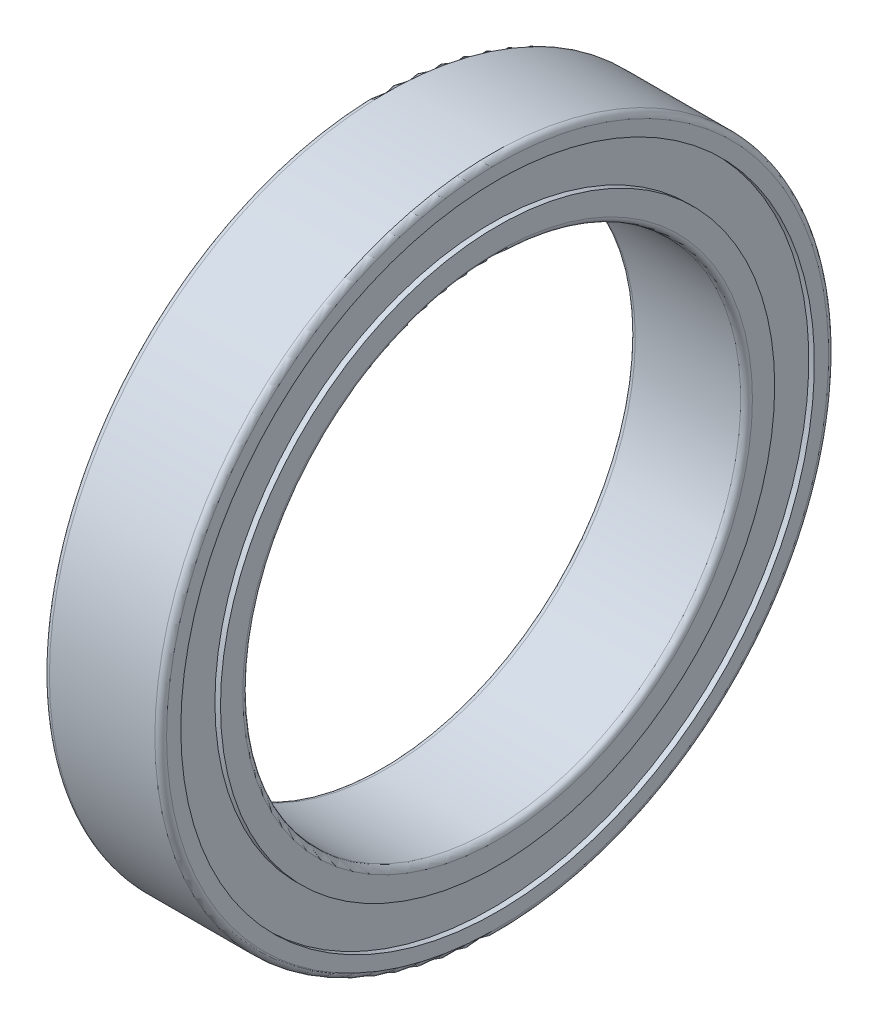
ISO-10303-21;
HEADER;
FILE_DESCRIPTION(('STEP AP214'),'2;1');
FILE_NAME('part.step','',(''),(''),'','','');
FILE_SCHEMA(('AUTOMOTIVE_DESIGN { 1 0 10303 214 1 1 1 1 }'));
ENDSEC;
DATA;
#1=APPLICATION_CONTEXT('core data for automotive mechanical design processes');
#2=APPLICATION_PROTOCOL_DEFINITION('international standard','automotive_design',2000,#1);
#3=PRODUCT_CONTEXT('',#1,'mechanical');
#4=PRODUCT('Part','Part','',(#3));
#5=PRODUCT_RELATED_PRODUCT_CATEGORY('part','',(#4));
#6=PRODUCT_DEFINITION_FORMATION('','',#4);
#7=PRODUCT_DEFINITION_CONTEXT('part definition',#1,'design');
#8=PRODUCT_DEFINITION('design','',#6,#7);
#9=PRODUCT_DEFINITION_SHAPE('','',#8);
#10=(LENGTH_UNIT() NAMED_UNIT(*) SI_UNIT(.MILLI.,.METRE.));
#11=(NAMED_UNIT(*) PLANE_ANGLE_UNIT() SI_UNIT($,.RADIAN.));
#12=(NAMED_UNIT(*) SI_UNIT($,.STERADIAN.) SOLID_ANGLE_UNIT());
#13=UNCERTAINTY_MEASURE_WITH_UNIT(LENGTH_MEASURE(1.E-05),#10,'distance_accuracy_value','');
#14=(GEOMETRIC_REPRESENTATION_CONTEXT(3) GLOBAL_UNCERTAINTY_ASSIGNED_CONTEXT((#13)) GLOBAL_UNIT_ASSIGNED_CONTEXT((#10,
#11,#12)) REPRESENTATION_CONTEXT('',''));
#15=CARTESIAN_POINT('',(0.,0.,0.));
#16=DIRECTION('',(0.,0.,1.));
#17=DIRECTION('',(1.,0.,0.));
#18=AXIS2_PLACEMENT_3D('',#15,#16,#17);
#19=CARTESIAN_POINT('',(0.,11.5,0.));
#20=DIRECTION('',(1.,0.,0.));
#21=DIRECTION('',(0.,0.,-1.));
#22=AXIS2_PLACEMENT_3D('',#19,#20,#21);
#23=PLANE('',#22);
#24=CARTESIAN_POINT('',(0.,0.,0.));
#25=DIRECTION('',(1.,0.,0.));
#26=DIRECTION('',(0.,0.,-1.));
#27=AXIS2_PLACEMENT_3D('',#24,#25,#26);
#28=CIRCLE('',#27,11.3);
#29=CARTESIAN_POINT('',(0.,0.,-11.3));
#30=VERTEX_POINT('',#29);
#31=EDGE_CURVE('E60',#30,#30,#28,.F.);
#32=ORIENTED_EDGE('',*,*,#31,.T.);
#33=EDGE_LOOP('',(#32));
#34=FACE_BOUND('',#33,.T.);
#35=CARTESIAN_POINT('',(0.,0.,0.));
#36=DIRECTION('',(-1.,0.,0.));
#37=DIRECTION('',(0.,0.,1.));
#38=AXIS2_PLACEMENT_3D('',#35,#36,#37);
#39=CIRCLE('',#38,10.815);
#40=CARTESIAN_POINT('',(0.,0.,10.815));
#41=VERTEX_POINT('',#40);
#42=EDGE_CURVE('E68',#41,#41,#39,.T.);
#43=ORIENTED_EDGE('',*,*,#42,.F.);
#44=EDGE_LOOP('',(#43));
#45=FACE_BOUND('',#44,.T.);
#46=ADVANCED_FACE('F40',(#34,#45),#23,.F.);
#47=CARTESIAN_POINT('',(0.,0.,0.));
#48=DIRECTION('',(-1.,0.,0.));
#49=DIRECTION('',(0.,0.,1.));
#50=AXIS2_PLACEMENT_3D('',#47,#48,#49);
#51=CYLINDRICAL_SURFACE('',#50,10.815);
#52=CARTESIAN_POINT('',(0.19,0.,0.));
#53=DIRECTION('',(-1.,0.,0.));
#54=DIRECTION('',(0.,0.,1.));
#55=AXIS2_PLACEMENT_3D('',#52,#53,#54);
#56=CIRCLE('',#55,10.815);
#57=CARTESIAN_POINT('',(0.19,0.,10.815));
#58=VERTEX_POINT('',#57);
#59=EDGE_CURVE('E75',#58,#58,#56,.T.);
#60=ORIENTED_EDGE('',*,*,#59,.F.);
#61=EDGE_LOOP('',(#60));
#62=FACE_BOUND('',#61,.T.);
#63=ORIENTED_EDGE('',*,*,#42,.T.);
#64=EDGE_LOOP('',(#63));
#65=FACE_BOUND('',#64,.T.);
#66=ADVANCED_FACE('F127',(#62,#65),#51,.F.);
#67=CARTESIAN_POINT('',(0.19,10.815,0.));
#68=DIRECTION('',(1.,0.,0.));
#69=DIRECTION('',(0.,0.,-1.));
#70=AXIS2_PLACEMENT_3D('',#67,#68,#69);
#71=PLANE('',#70);
#72=CARTESIAN_POINT('',(0.19,0.,0.));
#73=DIRECTION('',(-1.,0.,0.));
#74=DIRECTION('',(0.,0.,1.));
#75=AXIS2_PLACEMENT_3D('',#72,#73,#74);
#76=CIRCLE('',#75,9.46);
#77=CARTESIAN_POINT('',(0.19,0.,9.46));
#78=VERTEX_POINT('',#77);
#79=EDGE_CURVE('E73',#78,#78,#76,.T.);
#80=ORIENTED_EDGE('',*,*,#79,.F.);
#81=EDGE_LOOP('',(#80));
#82=FACE_BOUND('',#81,.T.);
#83=ORIENTED_EDGE('',*,*,#59,.T.);
#84=EDGE_LOOP('',(#83));
#85=FACE_BOUND('',#84,.T.);
#86=ADVANCED_FACE('F134',(#82,#85),#71,.F.);
#87=CARTESIAN_POINT('',(0.,0.,0.));
#88=DIRECTION('',(-1.,0.,0.));
#89=DIRECTION('',(0.,0.,1.));
#90=AXIS2_PLACEMENT_3D('',#87,#88,#89);
#91=CYLINDRICAL_SURFACE('',#90,9.46);
#92=CARTESIAN_POINT('',(0.,0.,0.));
#93=DIRECTION('',(-1.,0.,0.));
#94=DIRECTION('',(0.,0.,1.));
#95=AXIS2_PLACEMENT_3D('',#92,#93,#94);
#96=CIRCLE('',#95,9.46);
#97=CARTESIAN_POINT('',(0.,0.,9.46));
#98=VERTEX_POINT('',#97);
#99=EDGE_CURVE('E76',#98,#98,#96,.T.);
#100=ORIENTED_EDGE('',*,*,#99,.F.);
#101=EDGE_LOOP('',(#100));
#102=FACE_BOUND('',#101,.T.);
#103=ORIENTED_EDGE('',*,*,#79,.T.);
#104=EDGE_LOOP('',(#103));
#105=FACE_BOUND('',#104,.T.);
#106=ADVANCED_FACE('F209',(#102,#105),#91,.T.);
#107=CARTESIAN_POINT('',(0.,9.46,0.));
#108=DIRECTION('',(1.,0.,0.));
#109=DIRECTION('',(0.,0.,-1.));
#110=AXIS2_PLACEMENT_3D('',#107,#108,#109);
#111=PLANE('',#110);
#112=CARTESIAN_POINT('',(0.,0.,0.));
#113=DIRECTION('',(1.,0.,0.));
#114=DIRECTION('',(0.,0.,-1.));
#115=AXIS2_PLACEMENT_3D('',#112,#113,#114);
#116=CIRCLE('',#115,8.7);
#117=CARTESIAN_POINT('',(0.,0.,-8.7));
#118=VERTEX_POINT('',#117);
#119=EDGE_CURVE('E10',#118,#118,#116,.T.);
#120=ORIENTED_EDGE('',*,*,#119,.T.);
#121=EDGE_LOOP('',(#120));
#122=FACE_BOUND('',#121,.T.);
#123=ORIENTED_EDGE('',*,*,#99,.T.);
#124=EDGE_LOOP('',(#123));
#125=FACE_BOUND('',#124,.T.);
#126=ADVANCED_FACE('F124',(#122,#125),#111,.F.);
#127=CARTESIAN_POINT('',(0.,0.,0.));
#128=DIRECTION('',(-1.,0.,0.));
#129=DIRECTION('',(0.,0.,1.));
#130=AXIS2_PLACEMENT_3D('',#127,#128,#129);
#131=CYLINDRICAL_SURFACE('',#130,8.5);
#132=CARTESIAN_POINT('',(3.8,0.,0.));
#133=DIRECTION('',(-1.,0.,0.));
#134=DIRECTION('',(0.,0.,1.));
#135=AXIS2_PLACEMENT_3D('',#132,#133,#134);
#136=CIRCLE('',#135,8.5);
#137=CARTESIAN_POINT('',(3.8,0.,8.5));
#138=VERTEX_POINT('',#137);
#139=EDGE_CURVE('E42',#138,#138,#136,.F.);
#140=ORIENTED_EDGE('',*,*,#139,.T.);
#141=EDGE_LOOP('',(#140));
#142=FACE_BOUND('',#141,.T.);
#143=CARTESIAN_POINT('',(0.2,0.,0.));
#144=DIRECTION('',(1.,0.,0.));
#145=DIRECTION('',(0.,0.,-1.));
#146=AXIS2_PLACEMENT_3D('',#143,#144,#145);
#147=CIRCLE('',#146,8.5);
#148=CARTESIAN_POINT('',(0.2,0.,-8.5));
#149=VERTEX_POINT('',#148);
#150=EDGE_CURVE('E48',#149,#149,#147,.F.);
#151=ORIENTED_EDGE('',*,*,#150,.T.);
#152=EDGE_LOOP('',(#151));
#153=FACE_BOUND('',#152,.T.);
#154=ADVANCED_FACE('F116',(#142,#153),#131,.F.);
#155=CARTESIAN_POINT('',(4.,9.46,0.));
#156=DIRECTION('',(-1.,0.,0.));
#157=DIRECTION('',(0.,0.,1.));
#158=AXIS2_PLACEMENT_3D('',#155,#156,#157);
#159=PLANE('',#158);
#160=CARTESIAN_POINT('',(4.,0.,0.));
#161=DIRECTION('',(-1.,0.,0.));
#162=DIRECTION('',(0.,0.,1.));
#163=AXIS2_PLACEMENT_3D('',#160,#161,#162);
#164=CIRCLE('',#163,8.7);
#165=CARTESIAN_POINT('',(4.,0.,8.7));
#166=VERTEX_POINT('',#165);
#167=EDGE_CURVE('E55',#166,#166,#164,.T.);
#168=ORIENTED_EDGE('',*,*,#167,.T.);
#169=EDGE_LOOP('',(#168));
#170=FACE_BOUND('',#169,.T.);
#171=CARTESIAN_POINT('',(4.,0.,0.));
#172=DIRECTION('',(-1.,0.,0.));
#173=DIRECTION('',(0.,0.,1.));
#174=AXIS2_PLACEMENT_3D('',#171,#172,#173);
#175=CIRCLE('',#174,9.46);
#176=CARTESIAN_POINT('',(4.,0.,9.46));
#177=VERTEX_POINT('',#176);
#178=EDGE_CURVE('E82',#177,#177,#175,.T.);
#179=ORIENTED_EDGE('',*,*,#178,.F.);
#180=EDGE_LOOP('',(#179));
#181=FACE_BOUND('',#180,.T.);
#182=ADVANCED_FACE('F111',(#170,#181),#159,.F.);
#183=CARTESIAN_POINT('',(0.,0.,0.));
#184=DIRECTION('',(-1.,0.,0.));
#185=DIRECTION('',(0.,0.,1.));
#186=AXIS2_PLACEMENT_3D('',#183,#184,#185);
#187=CYLINDRICAL_SURFACE('',#186,9.46);
#188=CARTESIAN_POINT('',(3.81,0.,0.));
#189=DIRECTION('',(-1.,0.,0.));
#190=DIRECTION('',(0.,0.,1.));
#191=AXIS2_PLACEMENT_3D('',#188,#189,#190);
#192=CIRCLE('',#191,9.46);
#193=CARTESIAN_POINT('',(3.81,0.,9.46));
#194=VERTEX_POINT('',#193);
#195=EDGE_CURVE('E81',#194,#194,#192,.T.);
#196=ORIENTED_EDGE('',*,*,#195,.F.);
#197=EDGE_LOOP('',(#196));
#198=FACE_BOUND('',#197,.T.);
#199=ORIENTED_EDGE('',*,*,#178,.T.);
#200=EDGE_LOOP('',(#199));
#201=FACE_BOUND('',#200,.T.);
#202=ADVANCED_FACE('F102',(#198,#201),#187,.T.);
#203=CARTESIAN_POINT('',(3.81,10.815,0.));
#204=DIRECTION('',(-1.,0.,0.));
#205=DIRECTION('',(0.,0.,1.));
#206=AXIS2_PLACEMENT_3D('',#203,#204,#205);
#207=PLANE('',#206);
#208=CARTESIAN_POINT('',(3.81,0.,0.));
#209=DIRECTION('',(-1.,0.,0.));
#210=DIRECTION('',(0.,0.,1.));
#211=AXIS2_PLACEMENT_3D('',#208,#209,#210);
#212=CIRCLE('',#211,10.815);
#213=CARTESIAN_POINT('',(3.81,0.,10.815));
#214=VERTEX_POINT('',#213);
#215=EDGE_CURVE('E87',#214,#214,#212,.T.);
#216=ORIENTED_EDGE('',*,*,#215,.F.);
#217=EDGE_LOOP('',(#216));
#218=FACE_BOUND('',#217,.T.);
#219=ORIENTED_EDGE('',*,*,#195,.T.);
#220=EDGE_LOOP('',(#219));
#221=FACE_BOUND('',#220,.T.);
#222=ADVANCED_FACE('F100',(#218,#221),#207,.F.);
#223=CARTESIAN_POINT('',(0.,0.,0.));
#224=DIRECTION('',(-1.,0.,0.));
#225=DIRECTION('',(0.,0.,1.));
#226=AXIS2_PLACEMENT_3D('',#223,#224,#225);
#227=CYLINDRICAL_SURFACE('',#226,10.815);
#228=CARTESIAN_POINT('',(4.,0.,0.));
#229=DIRECTION('',(-1.,0.,0.));
#230=DIRECTION('',(0.,0.,1.));
#231=AXIS2_PLACEMENT_3D('',#228,#229,#230);
#232=CIRCLE('',#231,10.815);
#233=CARTESIAN_POINT('',(4.,0.,10.815));
#234=VERTEX_POINT('',#233);
#235=EDGE_CURVE('E90',#234,#234,#232,.T.);
#236=ORIENTED_EDGE('',*,*,#235,.F.);
#237=EDGE_LOOP('',(#236));
#238=FACE_BOUND('',#237,.T.);
#239=ORIENTED_EDGE('',*,*,#215,.T.);
#240=EDGE_LOOP('',(#239));
#241=FACE_BOUND('',#240,.T.);
#242=ADVANCED_FACE('F98',(#238,#241),#227,.F.);
#243=CARTESIAN_POINT('',(4.,11.5,0.));
#244=DIRECTION('',(-1.,0.,0.));
#245=DIRECTION('',(0.,0.,1.));
#246=AXIS2_PLACEMENT_3D('',#243,#244,#245);
#247=PLANE('',#246);
#248=CARTESIAN_POINT('',(4.,0.,0.));
#249=DIRECTION('',(-1.,0.,0.));
#250=DIRECTION('',(0.,0.,1.));
#251=AXIS2_PLACEMENT_3D('',#248,#249,#250);
#252=CIRCLE('',#251,11.3);
#253=CARTESIAN_POINT('',(4.,0.,11.3));
#254=VERTEX_POINT('',#253);
#255=EDGE_CURVE('E58',#254,#254,#252,.F.);
#256=ORIENTED_EDGE('',*,*,#255,.T.);
#257=EDGE_LOOP('',(#256));
#258=FACE_BOUND('',#257,.T.);
#259=ORIENTED_EDGE('',*,*,#235,.T.);
#260=EDGE_LOOP('',(#259));
#261=FACE_BOUND('',#260,.T.);
#262=ADVANCED_FACE('F91',(#258,#261),#247,.F.);
#263=CARTESIAN_POINT('',(0.,0.,0.));
#264=DIRECTION('',(-1.,0.,0.));
#265=DIRECTION('',(0.,0.,1.));
#266=AXIS2_PLACEMENT_3D('',#263,#264,#265);
#267=CYLINDRICAL_SURFACE('',#266,11.5);
#268=CARTESIAN_POINT('',(3.8,0.,0.));
#269=DIRECTION('',(-1.,0.,0.));
#270=DIRECTION('',(0.,0.,1.));
#271=AXIS2_PLACEMENT_3D('',#268,#269,#270);
#272=CIRCLE('',#271,11.5);
#273=CARTESIAN_POINT('',(3.8,0.,11.5));
#274=VERTEX_POINT('',#273);
#275=EDGE_CURVE('E65',#274,#274,#272,.T.);
#276=ORIENTED_EDGE('',*,*,#275,.T.);
#277=EDGE_LOOP('',(#276));
#278=FACE_BOUND('',#277,.T.);
#279=CARTESIAN_POINT('',(0.2,0.,0.));
#280=DIRECTION('',(1.,0.,0.));
#281=DIRECTION('',(0.,0.,-1.));
#282=AXIS2_PLACEMENT_3D('',#279,#280,#281);
#283=CIRCLE('',#282,11.5);
#284=CARTESIAN_POINT('',(0.2,0.,-11.5));
#285=VERTEX_POINT('',#284);
#286=EDGE_CURVE('E66',#285,#285,#283,.T.);
#287=ORIENTED_EDGE('',*,*,#286,.T.);
#288=EDGE_LOOP('',(#287));
#289=FACE_BOUND('',#288,.T.);
#290=ADVANCED_FACE('F141',(#278,#289),#267,.T.);
#291=CARTESIAN_POINT('',(3.8,0.,0.));
#292=DIRECTION('',(-1.,0.,0.));
#293=DIRECTION('',(0.,0.,1.));
#294=AXIS2_PLACEMENT_3D('',#291,#292,#293);
#295=TOROIDAL_SURFACE('',#294,11.3,0.2);
#296=ORIENTED_EDGE('',*,*,#255,.F.);
#297=EDGE_LOOP('',(#296));
#298=FACE_BOUND('',#297,.T.);
#299=ORIENTED_EDGE('',*,*,#275,.F.);
#300=EDGE_LOOP('',(#299));
#301=FACE_BOUND('',#300,.T.);
#302=ADVANCED_FACE('F136',(#298,#301),#295,.T.);
#303=CARTESIAN_POINT('',(0.2,0.,0.));
#304=DIRECTION('',(1.,0.,0.));
#305=DIRECTION('',(0.,0.,-1.));
#306=AXIS2_PLACEMENT_3D('',#303,#304,#305);
#307=TOROIDAL_SURFACE('',#306,11.3,0.2);
#308=ORIENTED_EDGE('',*,*,#286,.F.);
#309=EDGE_LOOP('',(#308));
#310=FACE_BOUND('',#309,.T.);
#311=ORIENTED_EDGE('',*,*,#31,.F.);
#312=EDGE_LOOP('',(#311));
#313=FACE_BOUND('',#312,.T.);
#314=ADVANCED_FACE('F145',(#310,#313),#307,.T.);
#315=CARTESIAN_POINT('',(3.8,0.,0.));
#316=DIRECTION('',(-1.,0.,0.));
#317=DIRECTION('',(0.,0.,1.));
#318=AXIS2_PLACEMENT_3D('',#315,#316,#317);
#319=TOROIDAL_SURFACE('',#318,8.7,0.2);
#320=ORIENTED_EDGE('',*,*,#139,.F.);
#321=EDGE_LOOP('',(#320));
#322=FACE_BOUND('',#321,.T.);
#323=ORIENTED_EDGE('',*,*,#167,.F.);
#324=EDGE_LOOP('',(#323));
#325=FACE_BOUND('',#324,.T.);
#326=ADVANCED_FACE('F147',(#322,#325),#319,.T.);
#327=CARTESIAN_POINT('',(0.2,0.,0.));
#328=DIRECTION('',(1.,0.,0.));
#329=DIRECTION('',(0.,0.,-1.));
#330=AXIS2_PLACEMENT_3D('',#327,#328,#329);
#331=TOROIDAL_SURFACE('',#330,8.7,0.2);
#332=ORIENTED_EDGE('',*,*,#119,.F.);
#333=EDGE_LOOP('',(#332));
#334=FACE_BOUND('',#333,.T.);
#335=ORIENTED_EDGE('',*,*,#150,.F.);
#336=EDGE_LOOP('',(#335));
#337=FACE_BOUND('',#336,.T.);
#338=ADVANCED_FACE('F39',(#334,#337),#331,.T.);
#339=CLOSED_SHELL('',(#46,#66,#86,#106,#126,#154,#182,#202,#222,#242,#262,#290,#302,#314,#326,#338));
#340=MANIFOLD_SOLID_BREP('B2',#339);
#341=ADVANCED_BREP_SHAPE_REPRESENTATION('',(#18,#340),#14);
#342=SHAPE_DEFINITION_REPRESENTATION(#9,#341);
ENDSEC;
END-ISO-10303-21;
